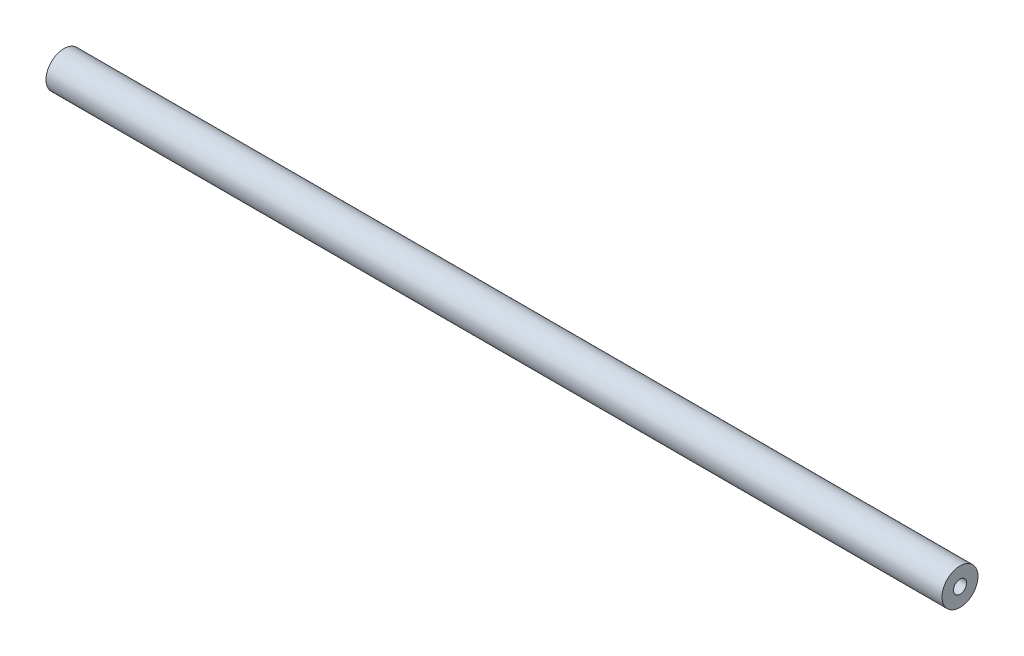
ISO-10303-21;
HEADER;
FILE_DESCRIPTION(('STEP AP214'),'2;1');
FILE_NAME('part.step','',(''),(''),'','','');
FILE_SCHEMA(('AUTOMOTIVE_DESIGN { 1 0 10303 214 1 1 1 1 }'));
ENDSEC;
DATA;
#1=APPLICATION_CONTEXT('core data for automotive mechanical design processes');
#2=APPLICATION_PROTOCOL_DEFINITION('international standard','automotive_design',2000,#1);
#3=PRODUCT_CONTEXT('',#1,'mechanical');
#4=PRODUCT('Part','Part','',(#3));
#5=PRODUCT_RELATED_PRODUCT_CATEGORY('part','',(#4));
#6=PRODUCT_DEFINITION_FORMATION('','',#4);
#7=PRODUCT_DEFINITION_CONTEXT('part definition',#1,'design');
#8=PRODUCT_DEFINITION('design','',#6,#7);
#9=PRODUCT_DEFINITION_SHAPE('','',#8);
#10=(LENGTH_UNIT() NAMED_UNIT(*) SI_UNIT(.MILLI.,.METRE.));
#11=(NAMED_UNIT(*) PLANE_ANGLE_UNIT() SI_UNIT($,.RADIAN.));
#12=(NAMED_UNIT(*) SI_UNIT($,.STERADIAN.) SOLID_ANGLE_UNIT());
#13=UNCERTAINTY_MEASURE_WITH_UNIT(LENGTH_MEASURE(1.E-05),#10,'distance_accuracy_value','');
#14=(GEOMETRIC_REPRESENTATION_CONTEXT(3) GLOBAL_UNCERTAINTY_ASSIGNED_CONTEXT((#13)) GLOBAL_UNIT_ASSIGNED_CONTEXT((#10,
#11,#12)) REPRESENTATION_CONTEXT('',''));
#15=CARTESIAN_POINT('',(0.,0.,0.));
#16=DIRECTION('',(0.,0.,1.));
#17=DIRECTION('',(1.,0.,0.));
#18=AXIS2_PLACEMENT_3D('',#15,#16,#17);
#19=CARTESIAN_POINT('',(224.,0.,0.));
#20=DIRECTION('',(1.,0.,0.));
#21=DIRECTION('',(0.,0.,-1.));
#22=AXIS2_PLACEMENT_3D('',#19,#20,#21);
#23=PLANE('',#22);
#24=CARTESIAN_POINT('',(224.,0.,0.));
#25=DIRECTION('',(1.,0.,0.));
#26=DIRECTION('',(0.,0.,-1.));
#27=AXIS2_PLACEMENT_3D('',#24,#25,#26);
#28=CIRCLE('',#27,4.5);
#29=CARTESIAN_POINT('',(224.,0.,-4.5));
#30=VERTEX_POINT('',#29);
#31=EDGE_CURVE('E10',#30,#30,#28,.T.);
#32=ORIENTED_EDGE('',*,*,#31,.T.);
#33=EDGE_LOOP('',(#32));
#34=FACE_BOUND('',#33,.T.);
#35=CARTESIAN_POINT('',(224.,0.,0.));
#36=DIRECTION('',(1.,0.,0.));
#37=DIRECTION('',(0.,0.,-1.));
#38=AXIS2_PLACEMENT_3D('',#35,#36,#37);
#39=CIRCLE('',#38,1.65);
#40=CARTESIAN_POINT('',(224.,0.,-1.65));
#41=VERTEX_POINT('',#40);
#42=EDGE_CURVE('E52',#41,#41,#39,.T.);
#43=ORIENTED_EDGE('',*,*,#42,.F.);
#44=EDGE_LOOP('',(#43));
#45=FACE_BOUND('',#44,.T.);
#46=ADVANCED_FACE('F41',(#34,#45),#23,.T.);
#47=CARTESIAN_POINT('',(0.,0.,0.));
#48=DIRECTION('',(1.,0.,0.));
#49=DIRECTION('',(0.,0.,-1.));
#50=AXIS2_PLACEMENT_3D('',#47,#48,#49);
#51=PLANE('',#50);
#52=CARTESIAN_POINT('',(0.,0.,0.));
#53=DIRECTION('',(1.,0.,0.));
#54=DIRECTION('',(0.,0.,-1.));
#55=AXIS2_PLACEMENT_3D('',#52,#53,#54);
#56=CIRCLE('',#55,4.5);
#57=CARTESIAN_POINT('',(0.,0.,-4.5));
#58=VERTEX_POINT('',#57);
#59=EDGE_CURVE('E45',#58,#58,#56,.T.);
#60=ORIENTED_EDGE('',*,*,#59,.F.);
#61=EDGE_LOOP('',(#60));
#62=FACE_BOUND('',#61,.T.);
#63=CARTESIAN_POINT('',(0.,0.,0.));
#64=DIRECTION('',(1.,0.,0.));
#65=DIRECTION('',(0.,0.,-1.));
#66=AXIS2_PLACEMENT_3D('',#63,#64,#65);
#67=CIRCLE('',#66,1.65);
#68=CARTESIAN_POINT('',(0.,0.,-1.65));
#69=VERTEX_POINT('',#68);
#70=EDGE_CURVE('E54',#69,#69,#67,.T.);
#71=ORIENTED_EDGE('',*,*,#70,.T.);
#72=EDGE_LOOP('',(#71));
#73=FACE_BOUND('',#72,.T.);
#74=ADVANCED_FACE('F64',(#62,#73),#51,.F.);
#75=CARTESIAN_POINT('',(224.,0.,0.));
#76=DIRECTION('',(-1.,0.,0.));
#77=DIRECTION('',(0.,0.,1.));
#78=AXIS2_PLACEMENT_3D('',#75,#76,#77);
#79=CYLINDRICAL_SURFACE('',#78,4.5);
#80=ORIENTED_EDGE('',*,*,#31,.F.);
#81=EDGE_LOOP('',(#80));
#82=FACE_BOUND('',#81,.T.);
#83=ORIENTED_EDGE('',*,*,#59,.T.);
#84=EDGE_LOOP('',(#83));
#85=FACE_BOUND('',#84,.T.);
#86=ADVANCED_FACE('F43',(#82,#85),#79,.T.);
#87=CARTESIAN_POINT('',(224.,0.,0.));
#88=DIRECTION('',(-1.,0.,0.));
#89=DIRECTION('',(0.,0.,1.));
#90=AXIS2_PLACEMENT_3D('',#87,#88,#89);
#91=CYLINDRICAL_SURFACE('',#90,1.65);
#92=ORIENTED_EDGE('',*,*,#42,.T.);
#93=EDGE_LOOP('',(#92));
#94=FACE_BOUND('',#93,.T.);
#95=ORIENTED_EDGE('',*,*,#70,.F.);
#96=EDGE_LOOP('',(#95));
#97=FACE_BOUND('',#96,.T.);
#98=ADVANCED_FACE('F60',(#94,#97),#91,.F.);
#99=CLOSED_SHELL('',(#46,#74,#86,#98));
#100=MANIFOLD_SOLID_BREP('B2',#99);
#101=ADVANCED_BREP_SHAPE_REPRESENTATION('',(#18,#100),#14);
#102=SHAPE_DEFINITION_REPRESENTATION(#9,#101);
ENDSEC;
END-ISO-10303-21;
